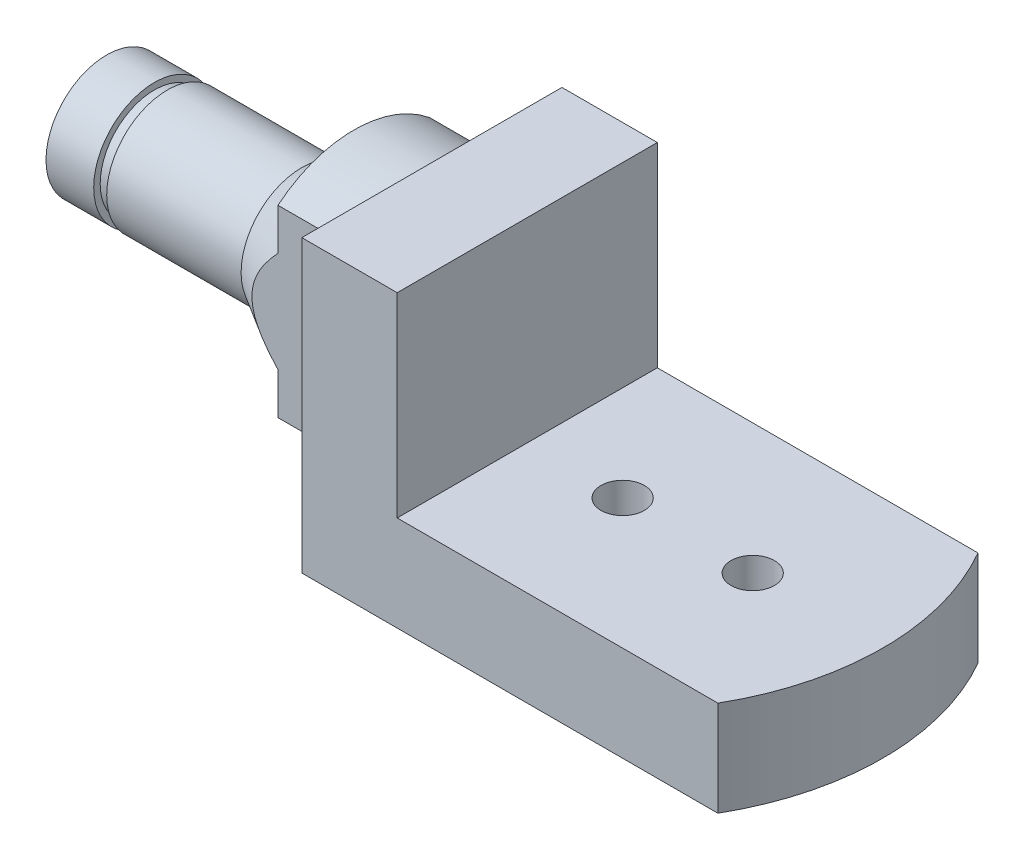
ISO-10303-21;
HEADER;
FILE_DESCRIPTION(('STEP AP214'),'2;1');
FILE_NAME('part.step','',(''),(''),'','','');
FILE_SCHEMA(('AUTOMOTIVE_DESIGN { 1 0 10303 214 1 1 1 1 }'));
ENDSEC;
DATA;
#1=APPLICATION_CONTEXT('core data for automotive mechanical design processes');
#2=APPLICATION_PROTOCOL_DEFINITION('international standard','automotive_design',2000,#1);
#3=PRODUCT_CONTEXT('',#1,'mechanical');
#4=PRODUCT('Part','Part','',(#3));
#5=PRODUCT_RELATED_PRODUCT_CATEGORY('part','',(#4));
#6=PRODUCT_DEFINITION_FORMATION('','',#4);
#7=PRODUCT_DEFINITION_CONTEXT('part definition',#1,'design');
#8=PRODUCT_DEFINITION('design','',#6,#7);
#9=PRODUCT_DEFINITION_SHAPE('','',#8);
#10=(LENGTH_UNIT() NAMED_UNIT(*) SI_UNIT(.MILLI.,.METRE.));
#11=(NAMED_UNIT(*) PLANE_ANGLE_UNIT() SI_UNIT($,.RADIAN.));
#12=(NAMED_UNIT(*) SI_UNIT($,.STERADIAN.) SOLID_ANGLE_UNIT());
#13=UNCERTAINTY_MEASURE_WITH_UNIT(LENGTH_MEASURE(1.E-05),#10,'distance_accuracy_value','');
#14=(GEOMETRIC_REPRESENTATION_CONTEXT(3) GLOBAL_UNCERTAINTY_ASSIGNED_CONTEXT((#13)) GLOBAL_UNIT_ASSIGNED_CONTEXT((#10,
#11,#12)) REPRESENTATION_CONTEXT('',''));
#15=CARTESIAN_POINT('',(0.,0.,0.));
#16=DIRECTION('',(0.,0.,1.));
#17=DIRECTION('',(1.,0.,0.));
#18=AXIS2_PLACEMENT_3D('',#15,#16,#17);
#19=CARTESIAN_POINT('',(-62.,37.,0.));
#20=DIRECTION('',(1.,0.,0.));
#21=DIRECTION('',(0.,0.,-1.));
#22=AXIS2_PLACEMENT_3D('',#19,#20,#21);
#23=CYLINDRICAL_SURFACE('',#22,27.5);
#24=DIRECTION('',(1.,0.,0.));
#25=VECTOR('',#24,1.);
#26=CARTESIAN_POINT('',(-62.,58.2132034355964,-17.5));
#27=LINE('',#26,#25);
#28=CARTESIAN_POINT('',(-62.,58.2132034355964,-17.5));
#29=VERTEX_POINT('',#28);
#30=CARTESIAN_POINT('',(-44.,58.2132034355964,-17.5));
#31=VERTEX_POINT('',#30);
#32=EDGE_CURVE('E137',#29,#31,#27,.T.);
#33=ORIENTED_EDGE('',*,*,#32,.F.);
#34=CARTESIAN_POINT('',(-62.,37.,0.));
#35=DIRECTION('',(-1.,0.,0.));
#36=DIRECTION('',(0.,0.,1.));
#37=AXIS2_PLACEMENT_3D('',#34,#35,#36);
#38=CIRCLE('',#37,27.5);
#39=CARTESIAN_POINT('',(-62.,58.2132034355964,17.5));
#40=VERTEX_POINT('',#39);
#41=EDGE_CURVE('E170',#40,#29,#38,.T.);
#42=ORIENTED_EDGE('',*,*,#41,.F.);
#43=DIRECTION('',(1.,0.,0.));
#44=VECTOR('',#43,1.);
#45=CARTESIAN_POINT('',(-62.,58.2132034355964,17.5));
#46=LINE('',#45,#44);
#47=CARTESIAN_POINT('',(-44.,58.2132034355964,17.5));
#48=VERTEX_POINT('',#47);
#49=EDGE_CURVE('E377',#48,#40,#46,.F.);
#50=ORIENTED_EDGE('',*,*,#49,.F.);
#51=CARTESIAN_POINT('',(-44.,37.,0.));
#52=DIRECTION('',(-1.,0.,0.));
#53=DIRECTION('',(0.,0.,1.));
#54=AXIS2_PLACEMENT_3D('',#51,#52,#53);
#55=CIRCLE('',#54,27.5);
#56=EDGE_CURVE('E160',#48,#31,#55,.T.);
#57=ORIENTED_EDGE('',*,*,#56,.T.);
#58=EDGE_LOOP('',(#33,#42,#50,#57));
#59=FACE_BOUND('',#58,.T.);
#60=ADVANCED_FACE('F41',(#59),#23,.T.);
#61=DIRECTION('',(1.,0.,0.));
#62=VECTOR('',#61,1.);
#63=CARTESIAN_POINT('',(-62.,15.7867965644036,-17.5));
#64=LINE('',#63,#62);
#65=CARTESIAN_POINT('',(-44.,15.7867965644036,-17.5));
#66=VERTEX_POINT('',#65);
#67=CARTESIAN_POINT('',(-62.,15.7867965644036,-17.5));
#68=VERTEX_POINT('',#67);
#69=EDGE_CURVE('E135',#66,#68,#64,.F.);
#70=ORIENTED_EDGE('',*,*,#69,.F.);
#71=CARTESIAN_POINT('',(-44.,15.7867965644036,17.5));
#72=VERTEX_POINT('',#71);
#73=EDGE_CURVE('E149',#66,#72,#55,.T.);
#74=ORIENTED_EDGE('',*,*,#73,.T.);
#75=DIRECTION('',(1.,0.,0.));
#76=VECTOR('',#75,1.);
#77=CARTESIAN_POINT('',(-62.,15.7867965644036,17.5));
#78=LINE('',#77,#76);
#79=CARTESIAN_POINT('',(-62.,15.7867965644036,17.5));
#80=VERTEX_POINT('',#79);
#81=EDGE_CURVE('E371',#80,#72,#78,.T.);
#82=ORIENTED_EDGE('',*,*,#81,.F.);
#83=EDGE_CURVE('E151',#68,#80,#38,.T.);
#84=ORIENTED_EDGE('',*,*,#83,.F.);
#85=EDGE_LOOP('',(#70,#74,#82,#84));
#86=FACE_BOUND('',#85,.T.);
#87=ADVANCED_FACE('F147',(#86),#23,.T.);
#88=CARTESIAN_POINT('',(-62.,0.,0.));
#89=DIRECTION('',(-1.,0.,0.));
#90=DIRECTION('',(0.,0.,1.));
#91=AXIS2_PLACEMENT_3D('',#88,#89,#90);
#92=PLANE('',#91);
#93=ORIENTED_EDGE('',*,*,#41,.T.);
#94=DIRECTION('',(0.,-1.,0.));
#95=VECTOR('',#94,1.);
#96=CARTESIAN_POINT('',(-62.,0.,-17.5));
#97=LINE('',#96,#95);
#98=CARTESIAN_POINT('',(-62.,48.6081867662439,-17.5));
#99=VERTEX_POINT('',#98);
#100=EDGE_CURVE('E153',#29,#99,#97,.T.);
#101=ORIENTED_EDGE('',*,*,#100,.T.);
#102=CARTESIAN_POINT('',(-62.,37.,0.));
#103=DIRECTION('',(1.,0.,0.));
#104=DIRECTION('',(0.,0.,-1.));
#105=AXIS2_PLACEMENT_3D('',#102,#103,#104);
#106=CIRCLE('',#105,21.);
#107=CARTESIAN_POINT('',(-62.,48.6081867662439,17.5));
#108=VERTEX_POINT('',#107);
#109=EDGE_CURVE('E66',#99,#108,#106,.T.);
#110=ORIENTED_EDGE('',*,*,#109,.T.);
#111=DIRECTION('',(0.,1.,0.));
#112=VECTOR('',#111,1.);
#113=CARTESIAN_POINT('',(-62.,0.,17.5));
#114=LINE('',#113,#112);
#115=EDGE_CURVE('E381',#108,#40,#114,.T.);
#116=ORIENTED_EDGE('',*,*,#115,.T.);
#117=EDGE_LOOP('',(#93,#101,#110,#116));
#118=FACE_BOUND('',#117,.T.);
#119=ADVANCED_FACE('F297',(#118),#92,.T.);
#120=CARTESIAN_POINT('',(-62.,25.3918132337561,17.5));
#121=VERTEX_POINT('',#120);
#122=CARTESIAN_POINT('',(-62.,25.3918132337561,-17.5));
#123=VERTEX_POINT('',#122);
#124=EDGE_CURVE('E350',#121,#123,#106,.T.);
#125=ORIENTED_EDGE('',*,*,#124,.T.);
#126=EDGE_CURVE('E58',#123,#68,#97,.T.);
#127=ORIENTED_EDGE('',*,*,#126,.T.);
#128=ORIENTED_EDGE('',*,*,#83,.T.);
#129=EDGE_CURVE('E380',#80,#121,#114,.T.);
#130=ORIENTED_EDGE('',*,*,#129,.T.);
#131=EDGE_LOOP('',(#125,#127,#128,#130));
#132=FACE_BOUND('',#131,.T.);
#133=ADVANCED_FACE('F325',(#132),#92,.T.);
#134=CARTESIAN_POINT('',(-62.,37.,0.));
#135=DIRECTION('',(1.,0.,0.));
#136=DIRECTION('',(0.,0.,-1.));
#137=AXIS2_PLACEMENT_3D('',#134,#135,#136);
#138=CONICAL_SURFACE('',#137,21.,0.52807444842636);
#139=CARTESIAN_POINT('',(-74.,37.,0.));
#140=DIRECTION('',(-1.,0.,0.));
#141=DIRECTION('',(0.,0.,1.));
#142=AXIS2_PLACEMENT_3D('',#139,#140,#141);
#143=CIRCLE('',#142,14.);
#144=CARTESIAN_POINT('',(-74.,37.,14.));
#145=VERTEX_POINT('',#144);
#146=EDGE_CURVE('E346',#145,#145,#143,.T.);
#147=ORIENTED_EDGE('',*,*,#146,.F.);
#148=EDGE_LOOP('',(#147));
#149=FACE_BOUND('',#148,.T.);
#150=ORIENTED_EDGE('',*,*,#109,.F.);
#151=CARTESIAN_POINT('',(-18.3191406643169,80.0602717032873,-17.5));
#152=CARTESIAN_POINT('',(-19.5766576698368,79.2684049784068,-17.5));
#153=CARTESIAN_POINT('',(-20.832825893387,78.4743872936624,-17.5));
#154=CARTESIAN_POINT('',(-23.3418642037698,76.8811130857151,-17.5));
#155=CARTESIAN_POINT('',(-24.5947342349542,76.0818564749035,-17.5));
#156=CARTESIAN_POINT('',(-27.0973875069317,74.476646146529,-17.5));
#157=CARTESIAN_POINT('',(-28.3471680559086,73.6706882287517,-17.5));
#158=CARTESIAN_POINT('',(-30.8419250465549,72.0513828000276,-17.5));
#159=CARTESIAN_POINT('',(-32.0869015185428,71.2380353358253,-17.5));
#160=CARTESIAN_POINT('',(-34.5751757074391,69.5995900189464,-17.5));
#161=CARTESIAN_POINT('',(-35.8184533392153,68.7744616261775,-17.5));
#162=CARTESIAN_POINT('',(-38.2975463618449,67.1130801396798,-17.5));
#163=CARTESIAN_POINT('',(-39.5333618137858,66.2768271372,-17.5));
#164=CARTESIAN_POINT('',(-41.9950535108902,64.5906748813114,-17.5));
#165=CARTESIAN_POINT('',(-43.2209330244366,63.7407804141894,-17.5));
#166=CARTESIAN_POINT('',(-45.0503198002646,62.4525763594226,-17.5));
#167=CARTESIAN_POINT('',(-45.658536885011,62.0209526149448,-17.5));
#168=CARTESIAN_POINT('',(-46.8713140421893,61.1526002720423,-17.5));
#169=CARTESIAN_POINT('',(-47.4758741382082,60.7158717065965,-17.5));
#170=CARTESIAN_POINT('',(-48.6799229395814,59.8371430260997,-17.5));
#171=CARTESIAN_POINT('',(-49.2794173212123,59.3951506961011,-17.5));
#172=CARTESIAN_POINT('',(-50.4733769516576,58.5044115884704,-17.5));
#173=CARTESIAN_POINT('',(-51.0678421803106,58.0556647837798,-17.5));
#174=CARTESIAN_POINT('',(-52.2510479613541,57.1500874197869,-17.5));
#175=CARTESIAN_POINT('',(-52.8397856106408,56.6932530614437,-17.5));
#176=CARTESIAN_POINT('',(-54.0099719455673,55.7703408964354,-17.5));
#177=CARTESIAN_POINT('',(-54.5914207233228,55.3042632067786,-17.5));
#178=CARTESIAN_POINT('',(-55.7481957810078,54.3588367131253,-17.5));
#179=CARTESIAN_POINT('',(-56.3234783033438,53.8794342210971,-17.5));
#180=CARTESIAN_POINT('',(-57.4627817920785,52.9073191621207,-17.5));
#181=CARTESIAN_POINT('',(-58.0268019751104,52.4146056748783,-17.5));
#182=CARTESIAN_POINT('',(-59.1399981028784,51.4134894235567,-17.5));
#183=CARTESIAN_POINT('',(-59.6891859226097,50.9050999531739,-17.5));
#184=CARTESIAN_POINT('',(-60.4987671650497,50.1278037532381,-17.5));
#185=CARTESIAN_POINT('',(-60.7662464036643,49.8662679200567,-17.5));
#186=CARTESIAN_POINT('',(-61.2957325420235,49.3377216386837,-17.5));
#187=CARTESIAN_POINT('',(-61.5577396518447,49.0707114014388,-17.5));
#188=CARTESIAN_POINT('',(-62.0794402170896,48.5263857104991,-17.5));
#189=CARTESIAN_POINT('',(-62.339033976883,48.2489745051259,-17.5));
#190=CARTESIAN_POINT('',(-62.8505130507649,47.6871531438674,-17.5));
#191=CARTESIAN_POINT('',(-63.1023989024079,47.4027434785666,-17.5));
#192=CARTESIAN_POINT('',(-63.5973316849957,46.8257841830739,-17.5));
#193=CARTESIAN_POINT('',(-63.8403689744015,46.5332262527154,-17.5));
#194=CARTESIAN_POINT('',(-64.3155469168698,45.9393825384587,-17.5));
#195=CARTESIAN_POINT('',(-64.5476878353244,45.6380969674202,-17.5));
#196=CARTESIAN_POINT('',(-64.9967199695848,45.0287659586768,-17.5));
#197=CARTESIAN_POINT('',(-65.2137369506821,44.7208140710163,-17.5));
#198=CARTESIAN_POINT('',(-65.6322274725447,44.0945704928638,-17.5));
#199=CARTESIAN_POINT('',(-65.8336988653943,43.7762773821401,-17.5));
#200=CARTESIAN_POINT('',(-66.4092756776655,42.805716665224,-17.5));
#201=CARTESIAN_POINT('',(-66.7558239457317,42.1360872212271,-17.5));
#202=CARTESIAN_POINT('',(-67.1754413838885,41.1414669301609,-17.5));
#203=CARTESIAN_POINT('',(-67.2925929540475,40.8348410004088,-17.5));
#204=CARTESIAN_POINT('',(-67.5029115016982,40.2133677300356,-17.5));
#205=CARTESIAN_POINT('',(-67.5960797834762,39.8985208375222,-17.5));
#206=CARTESIAN_POINT('',(-67.7551480340592,39.2623662776575,-17.5));
#207=CARTESIAN_POINT('',(-67.8210815531341,38.9410670738606,-17.5));
#208=CARTESIAN_POINT('',(-67.923203668227,38.2937339372392,-17.5));
#209=CARTESIAN_POINT('',(-67.9593936951271,37.9677002329472,-17.5));
#210=CARTESIAN_POINT('',(-68.0005438865115,37.3115308883412,-17.5));
#211=CARTESIAN_POINT('',(-68.0053012338542,36.9813823539651,-17.5));
#212=CARTESIAN_POINT('',(-67.9828222334447,36.3221936260556,-17.5));
#213=CARTESIAN_POINT('',(-67.9555860480854,35.9931534269051,-17.5));
#214=CARTESIAN_POINT('',(-67.8703411810151,35.3388356107882,-17.5));
#215=CARTESIAN_POINT('',(-67.8123056053674,35.0135615364289,-17.5));
#216=CARTESIAN_POINT('',(-67.6678956419971,34.3693987546563,-17.5));
#217=CARTESIAN_POINT('',(-67.5815165381885,34.0505111192593,-17.5));
#218=CARTESIAN_POINT('',(-67.3538884257723,33.3264080539243,-17.5));
#219=CARTESIAN_POINT('',(-67.2039545545624,32.9239268698052,-17.5));
#220=CARTESIAN_POINT('',(-66.8687821690446,32.1340100209493,-17.5));
#221=CARTESIAN_POINT('',(-66.6835283530899,31.7465809651358,-17.5));
#222=CARTESIAN_POINT('',(-66.2838132616365,30.9856289775049,-17.5));
#223=CARTESIAN_POINT('',(-66.0692603893716,30.6121545300392,-17.5));
#224=CARTESIAN_POINT('',(-65.7301695665904,30.0628057342349,-17.5));
#225=CARTESIAN_POINT('',(-65.6142681742254,29.8815081405531,-17.5));
#226=CARTESIAN_POINT('',(-65.3772706801392,29.5223305952009,-17.5));
#227=CARTESIAN_POINT('',(-65.2561744903663,29.3444507015344,-17.5));
#228=CARTESIAN_POINT('',(-64.9504247564115,28.9078290318122,-17.5));
#229=CARTESIAN_POINT('',(-64.7630209369377,28.6510123682812,-17.5));
#230=CARTESIAN_POINT('',(-64.3795287615398,28.1439305630222,-17.5));
#231=CARTESIAN_POINT('',(-64.1834392988069,27.8936662627624,-17.5));
#232=CARTESIAN_POINT('',(-63.5838657344233,27.151662674126,-17.5));
#233=CARTESIAN_POINT('',(-63.169224455487,26.6689201653928,-17.5));
#234=CARTESIAN_POINT('',(-62.3169432756242,25.7225317456245,-17.5));
#235=CARTESIAN_POINT('',(-61.879255700739,25.2589292671006,-17.5));
#236=CARTESIAN_POINT('',(-60.9869474793762,24.348582756242,-17.5));
#237=CARTESIAN_POINT('',(-60.5323305091993,23.9018351057314,-17.5));
#238=CARTESIAN_POINT('',(-59.6045860392801,23.0173744852992,-17.5));
#239=CARTESIAN_POINT('',(-59.1313073453427,22.5798208273983,-17.5));
#240=CARTESIAN_POINT('',(-58.1739178061091,21.7167244728709,-17.5));
#241=CARTESIAN_POINT('',(-57.6898064855185,21.2911823051228,-17.5));
#242=CARTESIAN_POINT('',(-56.7134976625519,20.4508494760172,-17.5));
#243=CARTESIAN_POINT('',(-56.221311937013,20.0360450979686,-17.5));
#244=CARTESIAN_POINT('',(-55.2297844557841,19.2151201931085,-17.5));
#245=CARTESIAN_POINT('',(-54.7304428511124,18.8089994834856,-17.5));
#246=CARTESIAN_POINT('',(-53.4974593222425,17.8212819221663,-17.5));
#247=CARTESIAN_POINT('',(-52.7604927010007,17.2438374482485,-17.5));
#248=CARTESIAN_POINT('',(-51.2767016921046,16.1017310638861,-17.5));
#249=CARTESIAN_POINT('',(-50.5298768624522,15.5370697296833,-17.5));
#250=CARTESIAN_POINT('',(-49.0282390066921,14.4182233648887,-17.5));
#251=CARTESIAN_POINT('',(-48.2734246678761,13.8640400989091,-17.5));
#252=CARTESIAN_POINT('',(-46.7574146288941,12.7645111011018,-17.5));
#253=CARTESIAN_POINT('',(-45.9962190286251,12.2191652313178,-17.5));
#254=CARTESIAN_POINT('',(-44.4675299786282,11.1352036215261,-17.5));
#255=CARTESIAN_POINT('',(-43.7000294807893,10.5965978326138,-17.5));
#256=CARTESIAN_POINT('',(-42.1606004586418,9.52575264309756,-17.5));
#257=CARTESIAN_POINT('',(-41.3886719196834,8.99351326357438,-17.5));
#258=CARTESIAN_POINT('',(-39.8411459005209,7.93455714770602,-17.5));
#259=CARTESIAN_POINT('',(-39.0655487742088,7.40783989382099,-17.5));
#260=CARTESIAN_POINT('',(-37.5111537519715,6.35914757495302,-17.5));
#261=CARTESIAN_POINT('',(-36.7323558448009,5.83717252665159,-17.5));
#262=CARTESIAN_POINT('',(-34.4951480631636,4.34627498629134,-17.5));
#263=CARTESIAN_POINT('',(-33.0333205956815,3.38247979733274,-17.5));
#264=CARTESIAN_POINT('',(-30.1022468896477,1.46617079639045,-17.5));
#265=CARTESIAN_POINT('',(-28.6330004459918,0.513657298761922,-17.5));
#266=CARTESIAN_POINT('',(-25.6922685035194,-1.37996135893867,-17.5));
#267=CARTESIAN_POINT('',(-24.2207973155357,-2.32108875625703,-17.5));
#268=CARTESIAN_POINT('',(-22.0101080288369,-3.72722000324147,-17.5));
#269=CARTESIAN_POINT('',(-21.2726485830488,-4.19499283160031,-17.5));
#270=CARTESIAN_POINT('',(-19.7966659499365,-5.12885444785431,-17.5));
#271=CARTESIAN_POINT('',(-19.0581427645157,-5.59494323875763,-17.5));
#272=CARTESIAN_POINT('',(-18.3191406643169,-6.06027170328732,-17.5));
#273=B_SPLINE_CURVE_WITH_KNOTS('',3,(#151,#152,#153,#154,#155,#156,#157,#158,#159,#160,#161,
#162,#163,#164,#165,#166,#167,#168,#169,#170,#171,#172,#173,#174,#175,#176,#177,#178,#179,#180,
#181,#182,#183,#184,#185,#186,#187,#188,#189,#190,#191,#192,#193,#194,#195,#196,#197,#198,#199,
#200,#201,#202,#203,#204,#205,#206,#207,#208,#209,#210,#211,#212,#213,#214,#215,#216,#217,#218,
#219,#220,#221,#222,#223,#224,#225,#226,#227,#228,#229,#230,#231,#232,#233,#234,#235,#236,#237,
#238,#239,#240,#241,#242,#243,#244,#245,#246,#247,#248,#249,#250,#251,#252,#253,#254,#255,#256,
#257,#258,#259,#260,#261,#262,#263,#264,#265,#266,#267,#268,#269,#270,#271,#272),.UNSPECIFIED.,
.F.,.F.,(4,2,2,2,2,2,2,2,2,2,2,2,2,2,2,2,2,2,2,2,2,2,2,2,2,2,2,2,2,2,2,2,2,2,2,2,2,2,2,2,2,2,2,
2,2,2,2,2,2,2,2,2,2,2,2,2,2,2,2,2,4),(0.,4.45821286714167,8.91650047870261,13.3778322536262,
17.839135826865,22.3156014267506,26.7920303313289,31.266921542257,33.5043195102261,
35.7417030318837,37.9761103596618,40.2105266408138,42.4460219332898,44.6814889453914,
46.927871279333,49.174409322899,51.4190919728302,52.5413089407274,53.6634827469009,
54.8031454001854,55.9427283906648,57.083518033777,58.2242798773721,59.3540097154603,
60.4838953685228,62.7373551493166,63.7213211449503,64.7052336181251,65.6879303769414,
66.6705798579993,67.6595636749356,68.6485424720047,69.6383862667863,70.628394845491,
71.9147702100713,73.2017041421576,74.4927576357877,75.1382242503471,75.7837018098857,
76.737242071441,77.6909041938654,79.5989916052743,81.5111943214305,83.4229841875823,
85.3563947555834,87.289890321276,89.2207801560169,91.1516293009235,93.9601872096388,
96.7688714721752,99.5780246063624,102.387133845888,105.199991339252,108.012858144079,
110.825458923861,113.638069593604,118.890856848043,124.143790124423,129.383850377581,
132.003757163377,134.62365926697),.UNSPECIFIED.);
#274=EDGE_CURVE('E143',#99,#123,#273,.T.);
#275=ORIENTED_EDGE('',*,*,#274,.T.);
#276=ORIENTED_EDGE('',*,*,#124,.F.);
#277=CARTESIAN_POINT('',(-18.3191406643169,-6.06027170328732,17.5));
#278=CARTESIAN_POINT('',(-19.5766576698368,-5.26840497840683,17.5));
#279=CARTESIAN_POINT('',(-20.832825893387,-4.47438729366236,17.5));
#280=CARTESIAN_POINT('',(-23.3418642037698,-2.88111308571511,17.5));
#281=CARTESIAN_POINT('',(-24.5947342349542,-2.08185647490348,17.5));
#282=CARTESIAN_POINT('',(-27.0973875069317,-0.476646146529002,17.5));
#283=CARTESIAN_POINT('',(-28.3471680559086,0.329311771248303,17.5));
#284=CARTESIAN_POINT('',(-30.8419250465548,1.94861719997241,17.5));
#285=CARTESIAN_POINT('',(-32.0869015185427,2.76196466417472,17.5));
#286=CARTESIAN_POINT('',(-34.5751757074391,4.4004099810536,17.5));
#287=CARTESIAN_POINT('',(-35.8184533392152,5.22553837382254,17.5));
#288=CARTESIAN_POINT('',(-38.2975463618449,6.88691986032019,17.5));
#289=CARTESIAN_POINT('',(-39.5333618137857,7.72317286280003,17.5));
#290=CARTESIAN_POINT('',(-41.9950535108902,9.40932511868856,17.5));
#291=CARTESIAN_POINT('',(-43.2209330244366,10.2592195858106,17.5));
#292=CARTESIAN_POINT('',(-45.0503198002645,11.5474236405774,17.5));
#293=CARTESIAN_POINT('',(-45.658536885011,11.9790473850552,17.5));
#294=CARTESIAN_POINT('',(-46.8713140421892,12.8473997279577,17.5));
#295=CARTESIAN_POINT('',(-47.4758741382082,13.2841282934035,17.5));
#296=CARTESIAN_POINT('',(-48.6799229395814,14.1628569739003,17.5));
#297=CARTESIAN_POINT('',(-49.2794173212122,14.6048493038989,17.5));
#298=CARTESIAN_POINT('',(-50.4733769516576,15.4955884115296,17.5));
#299=CARTESIAN_POINT('',(-51.0678421803105,15.9443352162201,17.5));
#300=CARTESIAN_POINT('',(-52.251047961354,16.8499125802131,17.5));
#301=CARTESIAN_POINT('',(-52.8397856106407,17.3067469385563,17.5));
#302=CARTESIAN_POINT('',(-54.0099719455673,18.2296591035646,17.5));
#303=CARTESIAN_POINT('',(-54.5914207233228,18.6957367932214,17.5));
#304=CARTESIAN_POINT('',(-55.7481957810078,19.6411632868747,17.5));
#305=CARTESIAN_POINT('',(-56.3234783033437,20.1205657789029,17.5));
#306=CARTESIAN_POINT('',(-57.4627817920785,21.0926808378793,17.5));
#307=CARTESIAN_POINT('',(-58.0268019751103,21.5853943251217,17.5));
#308=CARTESIAN_POINT('',(-59.1399981028784,22.5865105764432,17.5));
#309=CARTESIAN_POINT('',(-59.6891859226097,23.0949000468261,17.5));
#310=CARTESIAN_POINT('',(-60.4987671650496,23.8721962467619,17.5));
#311=CARTESIAN_POINT('',(-60.7662464036642,24.1337320799433,17.5));
#312=CARTESIAN_POINT('',(-61.2957325420235,24.6622783613163,17.5));
#313=CARTESIAN_POINT('',(-61.5577396518447,24.9292885985612,17.5));
#314=CARTESIAN_POINT('',(-62.0794402170895,25.4736142895009,17.5));
#315=CARTESIAN_POINT('',(-62.3390339768829,25.7510254948741,17.5));
#316=CARTESIAN_POINT('',(-62.8505130507648,26.3128468561326,17.5));
#317=CARTESIAN_POINT('',(-63.1023989024079,26.5972565214333,17.5));
#318=CARTESIAN_POINT('',(-63.5973316849957,27.1742158169261,17.5));
#319=CARTESIAN_POINT('',(-63.8403689744015,27.4667737472845,17.5));
#320=CARTESIAN_POINT('',(-64.3155469168697,28.0606174615413,17.5));
#321=CARTESIAN_POINT('',(-64.5476878353244,28.3619030325797,17.5));
#322=CARTESIAN_POINT('',(-64.9967199695848,28.9712340413232,17.5));
#323=CARTESIAN_POINT('',(-65.213736950682,29.2791859289836,17.5));
#324=CARTESIAN_POINT('',(-65.6322274725446,29.9054295071361,17.5));
#325=CARTESIAN_POINT('',(-65.8336988653942,30.2237226178598,17.5));
#326=CARTESIAN_POINT('',(-66.4092756776655,31.1942833347759,17.5));
#327=CARTESIAN_POINT('',(-66.7558239457317,31.8639127787729,17.5));
#328=CARTESIAN_POINT('',(-67.1754413838885,32.858533069839,17.5));
#329=CARTESIAN_POINT('',(-67.2925929540474,33.1651589995911,17.5));
#330=CARTESIAN_POINT('',(-67.5029115016982,33.7866322699643,17.5));
#331=CARTESIAN_POINT('',(-67.5960797834762,34.1014791624777,17.5));
#332=CARTESIAN_POINT('',(-67.7551480340592,34.7376337223424,17.5));
#333=CARTESIAN_POINT('',(-67.8210815531341,35.0589329261393,17.5));
#334=CARTESIAN_POINT('',(-67.9232036682269,35.7062660627607,17.5));
#335=CARTESIAN_POINT('',(-67.9593936951271,36.0322997670528,17.5));
#336=CARTESIAN_POINT('',(-68.0005438865115,36.6884691116587,17.5));
#337=CARTESIAN_POINT('',(-68.0053012338542,37.0186176460349,17.5));
#338=CARTESIAN_POINT('',(-67.9828222334447,37.6778063739443,17.5));
#339=CARTESIAN_POINT('',(-67.9555860480854,38.0068465730948,17.5));
#340=CARTESIAN_POINT('',(-67.8703411810151,38.6611643892118,17.5));
#341=CARTESIAN_POINT('',(-67.8123056053674,38.986438463571,17.5));
#342=CARTESIAN_POINT('',(-67.6678956419971,39.6306012453437,17.5));
#343=CARTESIAN_POINT('',(-67.5815165381885,39.9494888807406,17.5));
#344=CARTESIAN_POINT('',(-67.3538884257723,40.6735919460756,17.5));
#345=CARTESIAN_POINT('',(-67.2039545545624,41.0760731301948,17.5));
#346=CARTESIAN_POINT('',(-66.8687821690446,41.8659899790506,17.5));
#347=CARTESIAN_POINT('',(-66.6835283530899,42.2534190348641,17.5));
#348=CARTESIAN_POINT('',(-66.2838132616366,43.014371022495,17.5));
#349=CARTESIAN_POINT('',(-66.0692603893717,43.3878454699607,17.5));
#350=CARTESIAN_POINT('',(-65.7301695665905,43.937194265765,17.5));
#351=CARTESIAN_POINT('',(-65.6142681742255,44.1184918594467,17.5));
#352=CARTESIAN_POINT('',(-65.3772706801393,44.477669404799,17.5));
#353=CARTESIAN_POINT('',(-65.2561744903664,44.6555492984655,17.5));
#354=CARTESIAN_POINT('',(-64.9504247564116,45.0921709681877,17.5));
#355=CARTESIAN_POINT('',(-64.7630209369379,45.3489876317187,17.5));
#356=CARTESIAN_POINT('',(-64.3795287615399,45.8560694369776,17.5));
#357=CARTESIAN_POINT('',(-64.183439298807,46.1063337372375,17.5));
#358=CARTESIAN_POINT('',(-63.5838657344234,46.8483373258738,17.5));
#359=CARTESIAN_POINT('',(-63.1692244554872,47.331079834607,17.5));
#360=CARTESIAN_POINT('',(-62.3169432756244,48.2774682543753,17.5));
#361=CARTESIAN_POINT('',(-61.8792557007392,48.7410707328992,17.5));
#362=CARTESIAN_POINT('',(-60.9869474793765,49.6514172437578,17.5));
#363=CARTESIAN_POINT('',(-60.5323305091996,50.0981648942684,17.5));
#364=CARTESIAN_POINT('',(-59.6045860392804,50.9826255147005,17.5));
#365=CARTESIAN_POINT('',(-59.131307345343,51.4201791726014,17.5));
#366=CARTESIAN_POINT('',(-58.1739178061095,52.2832755271288,17.5));
#367=CARTESIAN_POINT('',(-57.6898064855189,52.7088176948769,17.5));
#368=CARTESIAN_POINT('',(-56.7134976625523,53.5491505239825,17.5));
#369=CARTESIAN_POINT('',(-56.2213119370134,53.9639549020311,17.5));
#370=CARTESIAN_POINT('',(-55.2297844557845,54.7848798068911,17.5));
#371=CARTESIAN_POINT('',(-54.7304428511128,55.1910005165141,17.5));
#372=CARTESIAN_POINT('',(-53.4974593222429,56.1787180778333,17.5));
#373=CARTESIAN_POINT('',(-52.7604927010012,56.7561625517512,17.5));
#374=CARTESIAN_POINT('',(-51.276701692105,57.8982689361136,17.5));
#375=CARTESIAN_POINT('',(-50.5298768624526,58.4629302703164,17.5));
#376=CARTESIAN_POINT('',(-49.0282390066925,59.5817766351111,17.5));
#377=CARTESIAN_POINT('',(-48.2734246678764,60.1359599010906,17.5));
#378=CARTESIAN_POINT('',(-46.7574146288945,61.2354888988979,17.5));
#379=CARTESIAN_POINT('',(-45.9962190286254,61.780834768682,17.5));
#380=CARTESIAN_POINT('',(-44.4675299786286,62.8647963784736,17.5));
#381=CARTESIAN_POINT('',(-43.7000294807896,63.403402167386,17.5));
#382=CARTESIAN_POINT('',(-42.1606004586421,64.4742473569023,17.5));
#383=CARTESIAN_POINT('',(-41.3886719196837,65.0064867364254,17.5));
#384=CARTESIAN_POINT('',(-39.8411459005211,66.0654428522938,17.5));
#385=CARTESIAN_POINT('',(-39.0655487742091,66.5921601061789,17.5));
#386=CARTESIAN_POINT('',(-37.5111537519717,67.6408524250468,17.5));
#387=CARTESIAN_POINT('',(-36.7323558448011,68.1628274733483,17.5));
#388=CARTESIAN_POINT('',(-34.4951480631638,69.6537250137086,17.5));
#389=CARTESIAN_POINT('',(-33.0333205956816,70.6175202026672,17.5));
#390=CARTESIAN_POINT('',(-30.1022468896478,72.5338292036095,17.5));
#391=CARTESIAN_POINT('',(-28.6330004459919,73.486342701238,17.5));
#392=CARTESIAN_POINT('',(-25.6922685035194,75.3799613589386,17.5));
#393=CARTESIAN_POINT('',(-24.2207973155358,76.321088756257,17.5));
#394=CARTESIAN_POINT('',(-22.0101080288369,77.7272200032415,17.5));
#395=CARTESIAN_POINT('',(-21.2726485830488,78.1949928316003,17.5));
#396=CARTESIAN_POINT('',(-19.7966659499365,79.1288544478543,17.5));
#397=CARTESIAN_POINT('',(-19.0581427645157,79.5949432387577,17.5));
#398=CARTESIAN_POINT('',(-18.3191406643169,80.0602717032873,17.5));
#399=B_SPLINE_CURVE_WITH_KNOTS('',3,(#277,#278,#279,#280,#281,#282,#283,#284,#285,#286,#287,
#288,#289,#290,#291,#292,#293,#294,#295,#296,#297,#298,#299,#300,#301,#302,#303,#304,#305,#306,
#307,#308,#309,#310,#311,#312,#313,#314,#315,#316,#317,#318,#319,#320,#321,#322,#323,#324,#325,
#326,#327,#328,#329,#330,#331,#332,#333,#334,#335,#336,#337,#338,#339,#340,#341,#342,#343,#344,
#345,#346,#347,#348,#349,#350,#351,#352,#353,#354,#355,#356,#357,#358,#359,#360,#361,#362,#363,
#364,#365,#366,#367,#368,#369,#370,#371,#372,#373,#374,#375,#376,#377,#378,#379,#380,#381,#382,
#383,#384,#385,#386,#387,#388,#389,#390,#391,#392,#393,#394,#395,#396,#397,#398),.UNSPECIFIED.,
.F.,.F.,(4,2,2,2,2,2,2,2,2,2,2,2,2,2,2,2,2,2,2,2,2,2,2,2,2,2,2,2,2,2,2,2,2,2,2,2,2,2,2,2,2,2,2,
2,2,2,2,2,2,2,2,2,2,2,2,2,2,2,2,2,4),(0.,4.45821286714166,8.91650047870259,13.3778322536261,
17.8391358268649,22.3156014267506,26.7920303313288,31.266921542257,33.5043195102261,
35.7417030318836,37.9761103596618,40.2105266408138,42.4460219332897,44.6814889453914,
46.9278712793329,49.1744093228989,51.4190919728301,52.5413089407274,53.6634827469008,
54.8031454001854,55.9427283906647,57.0835180337769,58.224279877372,59.3540097154602,
60.4838953685227,62.7373551493165,63.7213211449502,64.705233618125,65.6879303769413,
66.6705798579992,67.6595636749355,68.6485424720046,69.6383862667862,70.6283948454909,
71.9147702100712,73.2017041421575,74.4927576357875,75.1382242503469,75.7837018098856,
76.7372420714408,77.6909041938652,79.598991605274,81.5111943214302,83.422984187582,
85.356394755583,87.2898903212755,89.2207801560163,91.1516293009229,93.9601872096382,
96.7688714721748,99.5780246063619,102.387133845888,105.199991339252,108.012858144079,
110.825458923861,113.638069593603,118.890856848043,124.143790124422,129.383850377581,
132.003757163377,134.62365926697),.UNSPECIFIED.);
#400=EDGE_CURVE('E11',#121,#108,#399,.T.);
#401=ORIENTED_EDGE('',*,*,#400,.T.);
#402=EDGE_LOOP('',(#150,#275,#276,#401));
#403=FACE_BOUND('',#402,.T.);
#404=ADVANCED_FACE('F248',(#149,#403),#138,.T.);
#405=CARTESIAN_POINT('',(0.,22.,30.));
#406=DIRECTION('',(0.,0.,-1.));
#407=DIRECTION('',(-1.,0.,0.));
#408=AXIS2_PLACEMENT_3D('',#405,#406,#407);
#409=PLANE('',#408);
#410=DIRECTION('',(1.,0.,0.));
#411=VECTOR('',#410,1.);
#412=CARTESIAN_POINT('',(0.,0.,30.));
#413=LINE('',#412,#411);
#414=CARTESIAN_POINT('',(-44.,0.,30.));
#415=VERTEX_POINT('',#414);
#416=CARTESIAN_POINT('',(51.9615242270663,0.,30.));
#417=VERTEX_POINT('',#416);
#418=EDGE_CURVE('E230',#415,#417,#413,.T.);
#419=ORIENTED_EDGE('',*,*,#418,.T.);
#420=DIRECTION('',(0.,-1.,0.));
#421=VECTOR('',#420,1.);
#422=CARTESIAN_POINT('',(51.9615242270663,22.,30.));
#423=LINE('',#422,#421);
#424=CARTESIAN_POINT('',(51.9615242270663,22.,30.));
#425=VERTEX_POINT('',#424);
#426=EDGE_CURVE('E161',#425,#417,#423,.T.);
#427=ORIENTED_EDGE('',*,*,#426,.F.);
#428=DIRECTION('',(1.,0.,0.));
#429=VECTOR('',#428,1.);
#430=CARTESIAN_POINT('',(0.,22.,30.));
#431=LINE('',#430,#429);
#432=CARTESIAN_POINT('',(-22.,22.,30.));
#433=VERTEX_POINT('',#432);
#434=EDGE_CURVE('E211',#433,#425,#431,.T.);
#435=ORIENTED_EDGE('',*,*,#434,.F.);
#436=DIRECTION('',(0.,-1.,0.));
#437=VECTOR('',#436,1.);
#438=CARTESIAN_POINT('',(-22.,67.,30.));
#439=LINE('',#438,#437);
#440=CARTESIAN_POINT('',(-22.,67.,30.));
#441=VERTEX_POINT('',#440);
#442=EDGE_CURVE('E194',#441,#433,#439,.T.);
#443=ORIENTED_EDGE('',*,*,#442,.F.);
#444=DIRECTION('',(-1.,0.,0.));
#445=VECTOR('',#444,1.);
#446=CARTESIAN_POINT('',(0.,67.,30.));
#447=LINE('',#446,#445);
#448=CARTESIAN_POINT('',(-44.,67.,30.));
#449=VERTEX_POINT('',#448);
#450=EDGE_CURVE('E180',#441,#449,#447,.T.);
#451=ORIENTED_EDGE('',*,*,#450,.T.);
#452=DIRECTION('',(0.,-1.,0.));
#453=VECTOR('',#452,1.);
#454=CARTESIAN_POINT('',(-44.,67.,30.));
#455=LINE('',#454,#453);
#456=EDGE_CURVE('E198',#449,#415,#455,.T.);
#457=ORIENTED_EDGE('',*,*,#456,.T.);
#458=EDGE_LOOP('',(#419,#427,#435,#443,#451,#457));
#459=FACE_BOUND('',#458,.T.);
#460=ADVANCED_FACE('F318',(#459),#409,.F.);
#461=CARTESIAN_POINT('',(0.,22.,0.));
#462=DIRECTION('',(0.,-1.,0.));
#463=DIRECTION('',(0.,0.,-1.));
#464=AXIS2_PLACEMENT_3D('',#461,#462,#463);
#465=CYLINDRICAL_SURFACE('',#464,60.);
#466=CARTESIAN_POINT('',(0.,0.,0.));
#467=DIRECTION('',(0.,1.,0.));
#468=DIRECTION('',(0.,0.,1.));
#469=AXIS2_PLACEMENT_3D('',#466,#467,#468);
#470=CIRCLE('',#469,60.);
#471=CARTESIAN_POINT('',(51.9615242270663,0.,-30.));
#472=VERTEX_POINT('',#471);
#473=EDGE_CURVE('E234',#417,#472,#470,.T.);
#474=ORIENTED_EDGE('',*,*,#473,.T.);
#475=DIRECTION('',(0.,-1.,0.));
#476=VECTOR('',#475,1.);
#477=CARTESIAN_POINT('',(51.9615242270663,22.,-30.));
#478=LINE('',#477,#476);
#479=CARTESIAN_POINT('',(51.9615242270663,22.,-30.));
#480=VERTEX_POINT('',#479);
#481=EDGE_CURVE('E166',#480,#472,#478,.T.);
#482=ORIENTED_EDGE('',*,*,#481,.F.);
#483=CARTESIAN_POINT('',(0.,22.,0.));
#484=DIRECTION('',(0.,1.,0.));
#485=DIRECTION('',(0.,0.,1.));
#486=AXIS2_PLACEMENT_3D('',#483,#484,#485);
#487=CIRCLE('',#486,60.);
#488=EDGE_CURVE('E216',#425,#480,#487,.T.);
#489=ORIENTED_EDGE('',*,*,#488,.F.);
#490=ORIENTED_EDGE('',*,*,#426,.T.);
#491=EDGE_LOOP('',(#474,#482,#489,#490));
#492=FACE_BOUND('',#491,.T.);
#493=ADVANCED_FACE('F315',(#492),#465,.T.);
#494=CARTESIAN_POINT('',(0.,22.,-30.));
#495=DIRECTION('',(0.,0.,-1.));
#496=DIRECTION('',(-1.,0.,0.));
#497=AXIS2_PLACEMENT_3D('',#494,#495,#496);
#498=PLANE('',#497);
#499=DIRECTION('',(1.,0.,0.));
#500=VECTOR('',#499,1.);
#501=CARTESIAN_POINT('',(0.,0.,-30.));
#502=LINE('',#501,#500);
#503=CARTESIAN_POINT('',(-44.,0.,-30.));
#504=VERTEX_POINT('',#503);
#505=EDGE_CURVE('E212',#504,#472,#502,.T.);
#506=ORIENTED_EDGE('',*,*,#505,.F.);
#507=DIRECTION('',(0.,-1.,0.));
#508=VECTOR('',#507,1.);
#509=CARTESIAN_POINT('',(-44.,67.,-30.));
#510=LINE('',#509,#508);
#511=CARTESIAN_POINT('',(-44.,67.,-30.));
#512=VERTEX_POINT('',#511);
#513=EDGE_CURVE('E202',#512,#504,#510,.T.);
#514=ORIENTED_EDGE('',*,*,#513,.F.);
#515=DIRECTION('',(1.,0.,0.));
#516=VECTOR('',#515,1.);
#517=CARTESIAN_POINT('',(0.,67.,-30.));
#518=LINE('',#517,#516);
#519=CARTESIAN_POINT('',(-22.,67.,-30.));
#520=VERTEX_POINT('',#519);
#521=EDGE_CURVE('E172',#512,#520,#518,.T.);
#522=ORIENTED_EDGE('',*,*,#521,.T.);
#523=DIRECTION('',(0.,-1.,0.));
#524=VECTOR('',#523,1.);
#525=CARTESIAN_POINT('',(-22.,67.,-30.));
#526=LINE('',#525,#524);
#527=CARTESIAN_POINT('',(-22.,22.,-30.));
#528=VERTEX_POINT('',#527);
#529=EDGE_CURVE('E188',#520,#528,#526,.T.);
#530=ORIENTED_EDGE('',*,*,#529,.T.);
#531=DIRECTION('',(1.,0.,0.));
#532=VECTOR('',#531,1.);
#533=CARTESIAN_POINT('',(0.,22.,-30.));
#534=LINE('',#533,#532);
#535=EDGE_CURVE('E219',#528,#480,#534,.T.);
#536=ORIENTED_EDGE('',*,*,#535,.T.);
#537=ORIENTED_EDGE('',*,*,#481,.T.);
#538=EDGE_LOOP('',(#506,#514,#522,#530,#536,#537));
#539=FACE_BOUND('',#538,.T.);
#540=ADVANCED_FACE('F312',(#539),#498,.T.);
#541=CARTESIAN_POINT('',(30.,22.,0.));
#542=DIRECTION('',(0.,-1.,0.));
#543=DIRECTION('',(0.,0.,-1.));
#544=AXIS2_PLACEMENT_3D('',#541,#542,#543);
#545=CYLINDRICAL_SURFACE('',#544,5.);
#546=CARTESIAN_POINT('',(30.,22.,0.));
#547=DIRECTION('',(0.,1.,0.));
#548=DIRECTION('',(0.,0.,1.));
#549=AXIS2_PLACEMENT_3D('',#546,#547,#548);
#550=CIRCLE('',#549,5.);
#551=CARTESIAN_POINT('',(30.,22.,5.));
#552=VERTEX_POINT('',#551);
#553=EDGE_CURVE('E207',#552,#552,#550,.T.);
#554=ORIENTED_EDGE('',*,*,#553,.T.);
#555=EDGE_LOOP('',(#554));
#556=FACE_BOUND('',#555,.T.);
#557=CARTESIAN_POINT('',(30.,0.,0.));
#558=DIRECTION('',(0.,1.,0.));
#559=DIRECTION('',(0.,0.,1.));
#560=AXIS2_PLACEMENT_3D('',#557,#558,#559);
#561=CIRCLE('',#560,5.);
#562=CARTESIAN_POINT('',(30.,0.,5.));
#563=VERTEX_POINT('',#562);
#564=EDGE_CURVE('E206',#563,#563,#561,.T.);
#565=ORIENTED_EDGE('',*,*,#564,.F.);
#566=EDGE_LOOP('',(#565));
#567=FACE_BOUND('',#566,.T.);
#568=ADVANCED_FACE('F43',(#556,#567),#545,.F.);
#569=CARTESIAN_POINT('',(0.,22.,0.));
#570=DIRECTION('',(0.,1.,0.));
#571=DIRECTION('',(0.,0.,1.));
#572=AXIS2_PLACEMENT_3D('',#569,#570,#571);
#573=PLANE('',#572);
#574=CARTESIAN_POINT('',(0.,22.,0.));
#575=DIRECTION('',(0.,1.,0.));
#576=DIRECTION('',(0.,0.,1.));
#577=AXIS2_PLACEMENT_3D('',#574,#575,#576);
#578=CIRCLE('',#577,5.);
#579=CARTESIAN_POINT('',(0.,22.,5.));
#580=VERTEX_POINT('',#579);
#581=EDGE_CURVE('E396',#580,#580,#578,.T.);
#582=ORIENTED_EDGE('',*,*,#581,.F.);
#583=EDGE_LOOP('',(#582));
#584=FACE_BOUND('',#583,.T.);
#585=ORIENTED_EDGE('',*,*,#553,.F.);
#586=EDGE_LOOP('',(#585));
#587=FACE_BOUND('',#586,.T.);
#588=ORIENTED_EDGE('',*,*,#434,.T.);
#589=ORIENTED_EDGE('',*,*,#488,.T.);
#590=ORIENTED_EDGE('',*,*,#535,.F.);
#591=DIRECTION('',(0.,0.,-1.));
#592=VECTOR('',#591,1.);
#593=CARTESIAN_POINT('',(-22.,22.,0.));
#594=LINE('',#593,#592);
#595=EDGE_CURVE('E223',#433,#528,#594,.T.);
#596=ORIENTED_EDGE('',*,*,#595,.F.);
#597=EDGE_LOOP('',(#588,#589,#590,#596));
#598=FACE_BOUND('',#597,.T.);
#599=ADVANCED_FACE('F305',(#584,#587,#598),#573,.T.);
#600=CARTESIAN_POINT('',(0.,0.,0.));
#601=DIRECTION('',(0.,1.,0.));
#602=DIRECTION('',(0.,0.,1.));
#603=AXIS2_PLACEMENT_3D('',#600,#601,#602);
#604=PLANE('',#603);
#605=CARTESIAN_POINT('',(0.,0.,0.));
#606=DIRECTION('',(0.,1.,0.));
#607=DIRECTION('',(0.,0.,1.));
#608=AXIS2_PLACEMENT_3D('',#605,#606,#607);
#609=CIRCLE('',#608,5.);
#610=CARTESIAN_POINT('',(0.,0.,5.));
#611=VERTEX_POINT('',#610);
#612=EDGE_CURVE('E45',#611,#611,#609,.T.);
#613=ORIENTED_EDGE('',*,*,#612,.T.);
#614=EDGE_LOOP('',(#613));
#615=FACE_BOUND('',#614,.T.);
#616=ORIENTED_EDGE('',*,*,#564,.T.);
#617=EDGE_LOOP('',(#616));
#618=FACE_BOUND('',#617,.T.);
#619=ORIENTED_EDGE('',*,*,#418,.F.);
#620=DIRECTION('',(0.,0.,-1.));
#621=VECTOR('',#620,1.);
#622=CARTESIAN_POINT('',(-44.,0.,0.));
#623=LINE('',#622,#621);
#624=EDGE_CURVE('E177',#415,#504,#623,.T.);
#625=ORIENTED_EDGE('',*,*,#624,.T.);
#626=ORIENTED_EDGE('',*,*,#505,.T.);
#627=ORIENTED_EDGE('',*,*,#473,.F.);
#628=EDGE_LOOP('',(#619,#625,#626,#627));
#629=FACE_BOUND('',#628,.T.);
#630=ADVANCED_FACE('F304',(#615,#618,#629),#604,.F.);
#631=CARTESIAN_POINT('',(-44.,67.,0.));
#632=DIRECTION('',(-1.,0.,0.));
#633=DIRECTION('',(0.,0.,1.));
#634=AXIS2_PLACEMENT_3D('',#631,#632,#633);
#635=PLANE('',#634);
#636=ORIENTED_EDGE('',*,*,#73,.F.);
#637=DIRECTION('',(0.,1.,0.));
#638=VECTOR('',#637,1.);
#639=CARTESIAN_POINT('',(-44.,0.,-17.5));
#640=LINE('',#639,#638);
#641=EDGE_CURVE('E132',#66,#31,#640,.T.);
#642=ORIENTED_EDGE('',*,*,#641,.T.);
#643=ORIENTED_EDGE('',*,*,#56,.F.);
#644=DIRECTION('',(0.,1.,0.));
#645=VECTOR('',#644,1.);
#646=CARTESIAN_POINT('',(-44.,0.,17.5));
#647=LINE('',#646,#645);
#648=EDGE_CURVE('E158',#72,#48,#647,.T.);
#649=ORIENTED_EDGE('',*,*,#648,.F.);
#650=EDGE_LOOP('',(#636,#642,#643,#649));
#651=FACE_BOUND('',#650,.T.);
#652=DIRECTION('',(0.,0.,-1.));
#653=VECTOR('',#652,1.);
#654=CARTESIAN_POINT('',(-44.,67.,0.));
#655=LINE('',#654,#653);
#656=EDGE_CURVE('E176',#449,#512,#655,.T.);
#657=ORIENTED_EDGE('',*,*,#656,.T.);
#658=ORIENTED_EDGE('',*,*,#513,.T.);
#659=ORIENTED_EDGE('',*,*,#624,.F.);
#660=ORIENTED_EDGE('',*,*,#456,.F.);
#661=EDGE_LOOP('',(#657,#658,#659,#660));
#662=FACE_BOUND('',#661,.T.);
#663=ADVANCED_FACE('F156',(#651,#662),#635,.T.);
#664=CARTESIAN_POINT('',(-22.,67.,0.));
#665=DIRECTION('',(1.,0.,0.));
#666=DIRECTION('',(0.,0.,-1.));
#667=AXIS2_PLACEMENT_3D('',#664,#665,#666);
#668=PLANE('',#667);
#669=ORIENTED_EDGE('',*,*,#442,.T.);
#670=ORIENTED_EDGE('',*,*,#595,.T.);
#671=ORIENTED_EDGE('',*,*,#529,.F.);
#672=DIRECTION('',(0.,0.,1.));
#673=VECTOR('',#672,1.);
#674=CARTESIAN_POINT('',(-22.,67.,0.));
#675=LINE('',#674,#673);
#676=EDGE_CURVE('E184',#520,#441,#675,.T.);
#677=ORIENTED_EDGE('',*,*,#676,.T.);
#678=EDGE_LOOP('',(#669,#670,#671,#677));
#679=FACE_BOUND('',#678,.T.);
#680=ADVANCED_FACE('F286',(#679),#668,.T.);
#681=CARTESIAN_POINT('',(0.,67.,0.));
#682=DIRECTION('',(0.,1.,0.));
#683=DIRECTION('',(0.,0.,1.));
#684=AXIS2_PLACEMENT_3D('',#681,#682,#683);
#685=PLANE('',#684);
#686=ORIENTED_EDGE('',*,*,#521,.F.);
#687=ORIENTED_EDGE('',*,*,#656,.F.);
#688=ORIENTED_EDGE('',*,*,#450,.F.);
#689=ORIENTED_EDGE('',*,*,#676,.F.);
#690=EDGE_LOOP('',(#686,#687,#688,#689));
#691=FACE_BOUND('',#690,.T.);
#692=ADVANCED_FACE('F281',(#691),#685,.T.);
#693=CARTESIAN_POINT('',(-105.,37.,0.));
#694=DIRECTION('',(1.,0.,0.));
#695=DIRECTION('',(0.,0.,-1.));
#696=AXIS2_PLACEMENT_3D('',#693,#694,#695);
#697=CYLINDRICAL_SURFACE('',#696,14.);
#698=CARTESIAN_POINT('',(-105.,37.,0.));
#699=DIRECTION('',(-1.,0.,0.));
#700=DIRECTION('',(0.,0.,1.));
#701=AXIS2_PLACEMENT_3D('',#698,#699,#700);
#702=CIRCLE('',#701,14.);
#703=CARTESIAN_POINT('',(-105.,37.,14.));
#704=VERTEX_POINT('',#703);
#705=EDGE_CURVE('E351',#704,#704,#702,.T.);
#706=ORIENTED_EDGE('',*,*,#705,.F.);
#707=EDGE_LOOP('',(#706));
#708=FACE_BOUND('',#707,.T.);
#709=ORIENTED_EDGE('',*,*,#146,.T.);
#710=EDGE_LOOP('',(#709));
#711=FACE_BOUND('',#710,.T.);
#712=ADVANCED_FACE('F278',(#708,#711),#697,.T.);
#713=CARTESIAN_POINT('',(-105.,37.,0.));
#714=DIRECTION('',(-1.,0.,0.));
#715=DIRECTION('',(0.,0.,1.));
#716=AXIS2_PLACEMENT_3D('',#713,#714,#715);
#717=PLANE('',#716);
#718=CARTESIAN_POINT('',(-105.,37.,0.));
#719=DIRECTION('',(-1.,0.,0.));
#720=DIRECTION('',(0.,0.,1.));
#721=AXIS2_PLACEMENT_3D('',#718,#719,#720);
#722=CIRCLE('',#721,12.5);
#723=CARTESIAN_POINT('',(-105.,37.,12.5));
#724=VERTEX_POINT('',#723);
#725=EDGE_CURVE('E51',#724,#724,#722,.T.);
#726=ORIENTED_EDGE('',*,*,#725,.F.);
#727=EDGE_LOOP('',(#726));
#728=FACE_BOUND('',#727,.T.);
#729=ORIENTED_EDGE('',*,*,#705,.T.);
#730=EDGE_LOOP('',(#729));
#731=FACE_BOUND('',#730,.T.);
#732=ADVANCED_FACE('F275',(#728,#731),#717,.T.);
#733=CARTESIAN_POINT('',(-108.,37.,0.));
#734=DIRECTION('',(1.,0.,0.));
#735=DIRECTION('',(0.,0.,-1.));
#736=AXIS2_PLACEMENT_3D('',#733,#734,#735);
#737=CYLINDRICAL_SURFACE('',#736,12.5);
#738=CARTESIAN_POINT('',(-108.,37.,0.));
#739=DIRECTION('',(-1.,0.,0.));
#740=DIRECTION('',(0.,0.,1.));
#741=AXIS2_PLACEMENT_3D('',#738,#739,#740);
#742=CIRCLE('',#741,12.5);
#743=CARTESIAN_POINT('',(-108.,37.,12.5));
#744=VERTEX_POINT('',#743);
#745=EDGE_CURVE('E358',#744,#744,#742,.T.);
#746=ORIENTED_EDGE('',*,*,#745,.F.);
#747=EDGE_LOOP('',(#746));
#748=FACE_BOUND('',#747,.T.);
#749=ORIENTED_EDGE('',*,*,#725,.T.);
#750=EDGE_LOOP('',(#749));
#751=FACE_BOUND('',#750,.T.);
#752=ADVANCED_FACE('F271',(#748,#751),#737,.T.);
#753=CARTESIAN_POINT('',(-119.,37.,0.));
#754=DIRECTION('',(1.,0.,0.));
#755=DIRECTION('',(0.,0.,-1.));
#756=AXIS2_PLACEMENT_3D('',#753,#754,#755);
#757=CYLINDRICAL_SURFACE('',#756,14.);
#758=CARTESIAN_POINT('',(-119.,37.,0.));
#759=DIRECTION('',(-1.,0.,0.));
#760=DIRECTION('',(0.,0.,1.));
#761=AXIS2_PLACEMENT_3D('',#758,#759,#760);
#762=CIRCLE('',#761,14.);
#763=CARTESIAN_POINT('',(-119.,37.,14.));
#764=VERTEX_POINT('',#763);
#765=EDGE_CURVE('E366',#764,#764,#762,.T.);
#766=ORIENTED_EDGE('',*,*,#765,.F.);
#767=EDGE_LOOP('',(#766));
#768=FACE_BOUND('',#767,.T.);
#769=CARTESIAN_POINT('',(-108.,37.,0.));
#770=DIRECTION('',(-1.,0.,0.));
#771=DIRECTION('',(0.,0.,1.));
#772=AXIS2_PLACEMENT_3D('',#769,#770,#771);
#773=CIRCLE('',#772,14.);
#774=CARTESIAN_POINT('',(-108.,37.,14.));
#775=VERTEX_POINT('',#774);
#776=EDGE_CURVE('E367',#775,#775,#773,.T.);
#777=ORIENTED_EDGE('',*,*,#776,.T.);
#778=EDGE_LOOP('',(#777));
#779=FACE_BOUND('',#778,.T.);
#780=ADVANCED_FACE('F264',(#768,#779),#757,.T.);
#781=CARTESIAN_POINT('',(-119.,37.,0.));
#782=DIRECTION('',(-1.,0.,0.));
#783=DIRECTION('',(0.,0.,1.));
#784=AXIS2_PLACEMENT_3D('',#781,#782,#783);
#785=PLANE('',#784);
#786=ORIENTED_EDGE('',*,*,#765,.T.);
#787=EDGE_LOOP('',(#786));
#788=FACE_BOUND('',#787,.T.);
#789=ADVANCED_FACE('F261',(#788),#785,.T.);
#790=CARTESIAN_POINT('',(-108.,37.,0.));
#791=DIRECTION('',(-1.,0.,0.));
#792=DIRECTION('',(0.,0.,1.));
#793=AXIS2_PLACEMENT_3D('',#790,#791,#792);
#794=PLANE('',#793);
#795=ORIENTED_EDGE('',*,*,#745,.T.);
#796=EDGE_LOOP('',(#795));
#797=FACE_BOUND('',#796,.T.);
#798=ORIENTED_EDGE('',*,*,#776,.F.);
#799=EDGE_LOOP('',(#798));
#800=FACE_BOUND('',#799,.T.);
#801=ADVANCED_FACE('F257',(#797,#800),#794,.F.);
#802=CARTESIAN_POINT('',(0.,0.,17.5));
#803=DIRECTION('',(0.,0.,1.));
#804=DIRECTION('',(1.,0.,0.));
#805=AXIS2_PLACEMENT_3D('',#802,#803,#804);
#806=PLANE('',#805);
#807=ORIENTED_EDGE('',*,*,#81,.T.);
#808=ORIENTED_EDGE('',*,*,#648,.T.);
#809=ORIENTED_EDGE('',*,*,#49,.T.);
#810=ORIENTED_EDGE('',*,*,#115,.F.);
#811=ORIENTED_EDGE('',*,*,#400,.F.);
#812=ORIENTED_EDGE('',*,*,#129,.F.);
#813=EDGE_LOOP('',(#807,#808,#809,#810,#811,#812));
#814=FACE_BOUND('',#813,.T.);
#815=ADVANCED_FACE('F252',(#814),#806,.T.);
#816=CARTESIAN_POINT('',(0.,0.,-17.5));
#817=DIRECTION('',(0.,0.,-1.));
#818=DIRECTION('',(1.,0.,0.));
#819=AXIS2_PLACEMENT_3D('',#816,#817,#818);
#820=PLANE('',#819);
#821=ORIENTED_EDGE('',*,*,#32,.T.);
#822=ORIENTED_EDGE('',*,*,#641,.F.);
#823=ORIENTED_EDGE('',*,*,#69,.T.);
#824=ORIENTED_EDGE('',*,*,#126,.F.);
#825=ORIENTED_EDGE('',*,*,#274,.F.);
#826=ORIENTED_EDGE('',*,*,#100,.F.);
#827=EDGE_LOOP('',(#821,#822,#823,#824,#825,#826));
#828=FACE_BOUND('',#827,.T.);
#829=ADVANCED_FACE('F134',(#828),#820,.T.);
#830=CARTESIAN_POINT('',(0.,-10.5,0.));
#831=DIRECTION('',(0.,1.,0.));
#832=DIRECTION('',(0.,0.,1.));
#833=AXIS2_PLACEMENT_3D('',#830,#831,#832);
#834=CYLINDRICAL_SURFACE('',#833,5.);
#835=ORIENTED_EDGE('',*,*,#581,.T.);
#836=EDGE_LOOP('',(#835));
#837=FACE_BOUND('',#836,.T.);
#838=ORIENTED_EDGE('',*,*,#612,.F.);
#839=EDGE_LOOP('',(#838));
#840=FACE_BOUND('',#839,.T.);
#841=ADVANCED_FACE('F406',(#837,#840),#834,.F.);
#842=CLOSED_SHELL('',(#60,#87,#119,#133,#404,#460,#493,#540,#568,#599,#630,#663,#680,#692,#712,
#732,#752,#780,#789,#801,#815,#829,#841));
#843=MANIFOLD_SOLID_BREP('B2',#842);
#844=ADVANCED_BREP_SHAPE_REPRESENTATION('',(#18,#843),#14);
#845=SHAPE_DEFINITION_REPRESENTATION(#9,#844);
ENDSEC;
END-ISO-10303-21;
